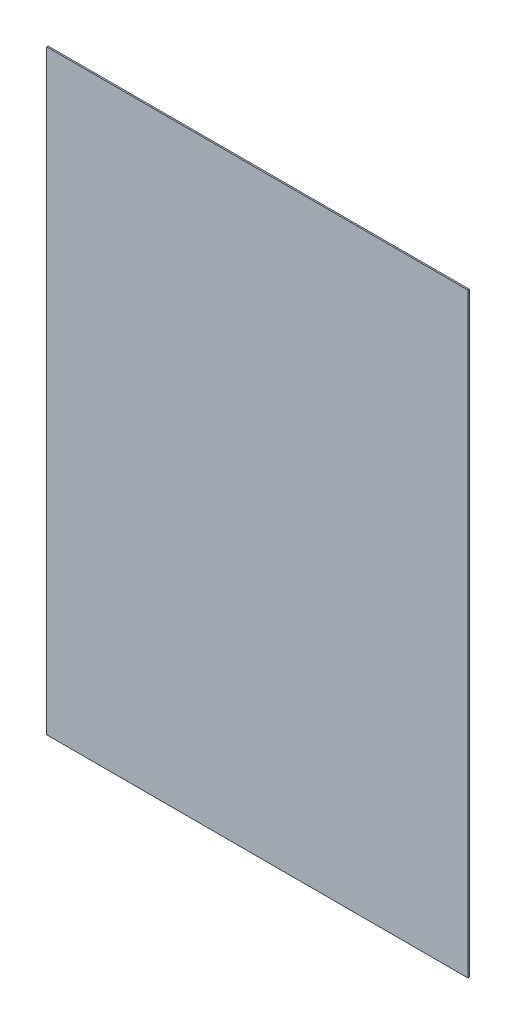
ISO-10303-21;
HEADER;
FILE_DESCRIPTION(('STEP AP214'),'2;1');
FILE_NAME('part.step','',(''),(''),'','','');
FILE_SCHEMA(('AUTOMOTIVE_DESIGN { 1 0 10303 214 1 1 1 1 }'));
ENDSEC;
DATA;
#1=APPLICATION_CONTEXT('core data for automotive mechanical design processes');
#2=APPLICATION_PROTOCOL_DEFINITION('international standard','automotive_design',2000,#1);
#3=PRODUCT_CONTEXT('',#1,'mechanical');
#4=PRODUCT('Part','Part','',(#3));
#5=PRODUCT_RELATED_PRODUCT_CATEGORY('part','',(#4));
#6=PRODUCT_DEFINITION_FORMATION('','',#4);
#7=PRODUCT_DEFINITION_CONTEXT('part definition',#1,'design');
#8=PRODUCT_DEFINITION('design','',#6,#7);
#9=PRODUCT_DEFINITION_SHAPE('','',#8);
#10=(LENGTH_UNIT() NAMED_UNIT(*) SI_UNIT(.MILLI.,.METRE.));
#11=(NAMED_UNIT(*) PLANE_ANGLE_UNIT() SI_UNIT($,.RADIAN.));
#12=(NAMED_UNIT(*) SI_UNIT($,.STERADIAN.) SOLID_ANGLE_UNIT());
#13=UNCERTAINTY_MEASURE_WITH_UNIT(LENGTH_MEASURE(1.E-05),#10,'distance_accuracy_value','');
#14=(GEOMETRIC_REPRESENTATION_CONTEXT(3) GLOBAL_UNCERTAINTY_ASSIGNED_CONTEXT((#13)) GLOBAL_UNIT_ASSIGNED_CONTEXT((#10,
#11,#12)) REPRESENTATION_CONTEXT('',''));
#15=CARTESIAN_POINT('',(0.,0.,0.));
#16=DIRECTION('',(0.,0.,1.));
#17=DIRECTION('',(1.,0.,0.));
#18=AXIS2_PLACEMENT_3D('',#15,#16,#17);
#19=CARTESIAN_POINT('',(0.,0.,0.5));
#20=DIRECTION('',(1.,0.,0.));
#21=DIRECTION('',(0.,0.,-1.));
#22=AXIS2_PLACEMENT_3D('',#19,#20,#21);
#23=PLANE('',#22);
#24=DIRECTION('',(0.,-1.,0.));
#25=VECTOR('',#24,1.);
#26=CARTESIAN_POINT('',(0.,0.,0.));
#27=LINE('',#26,#25);
#28=CARTESIAN_POINT('',(0.,210.,0.));
#29=VERTEX_POINT('',#28);
#30=CARTESIAN_POINT('',(0.,0.,0.));
#31=VERTEX_POINT('',#30);
#32=EDGE_CURVE('E95',#29,#31,#27,.T.);
#33=ORIENTED_EDGE('',*,*,#32,.T.);
#34=DIRECTION('',(0.,0.,-1.));
#35=VECTOR('',#34,1.);
#36=CARTESIAN_POINT('',(0.,0.,0.5));
#37=LINE('',#36,#35);
#38=CARTESIAN_POINT('',(0.,0.,0.5));
#39=VERTEX_POINT('',#38);
#40=EDGE_CURVE('E11',#39,#31,#37,.T.);
#41=ORIENTED_EDGE('',*,*,#40,.F.);
#42=DIRECTION('',(0.,-1.,0.));
#43=VECTOR('',#42,1.);
#44=CARTESIAN_POINT('',(0.,0.,0.5));
#45=LINE('',#44,#43);
#46=CARTESIAN_POINT('',(0.,210.,0.5));
#47=VERTEX_POINT('',#46);
#48=EDGE_CURVE('E83',#47,#39,#45,.T.);
#49=ORIENTED_EDGE('',*,*,#48,.F.);
#50=DIRECTION('',(0.,0.,-1.));
#51=VECTOR('',#50,1.);
#52=CARTESIAN_POINT('',(0.,210.,0.5));
#53=LINE('',#52,#51);
#54=EDGE_CURVE('E91',#47,#29,#53,.T.);
#55=ORIENTED_EDGE('',*,*,#54,.T.);
#56=EDGE_LOOP('',(#33,#41,#49,#55));
#57=FACE_BOUND('',#56,.T.);
#58=ADVANCED_FACE('F32',(#57),#23,.F.);
#59=CARTESIAN_POINT('',(0.,0.,0.5));
#60=DIRECTION('',(0.,1.,0.));
#61=DIRECTION('',(0.,0.,1.));
#62=AXIS2_PLACEMENT_3D('',#59,#60,#61);
#63=PLANE('',#62);
#64=DIRECTION('',(1.,0.,0.));
#65=VECTOR('',#64,1.);
#66=CARTESIAN_POINT('',(0.,0.,0.));
#67=LINE('',#66,#65);
#68=CARTESIAN_POINT('',(148.5,0.,0.));
#69=VERTEX_POINT('',#68);
#70=EDGE_CURVE('E87',#31,#69,#67,.T.);
#71=ORIENTED_EDGE('',*,*,#70,.T.);
#72=DIRECTION('',(0.,0.,-1.));
#73=VECTOR('',#72,1.);
#74=CARTESIAN_POINT('',(148.5,0.,0.5));
#75=LINE('',#74,#73);
#76=CARTESIAN_POINT('',(148.5,0.,0.5));
#77=VERTEX_POINT('',#76);
#78=EDGE_CURVE('E40',#77,#69,#75,.T.);
#79=ORIENTED_EDGE('',*,*,#78,.F.);
#80=DIRECTION('',(1.,0.,0.));
#81=VECTOR('',#80,1.);
#82=CARTESIAN_POINT('',(0.,0.,0.5));
#83=LINE('',#82,#81);
#84=EDGE_CURVE('E78',#39,#77,#83,.T.);
#85=ORIENTED_EDGE('',*,*,#84,.F.);
#86=ORIENTED_EDGE('',*,*,#40,.T.);
#87=EDGE_LOOP('',(#71,#79,#85,#86));
#88=FACE_BOUND('',#87,.T.);
#89=ADVANCED_FACE('F86',(#88),#63,.F.);
#90=CARTESIAN_POINT('',(148.5,0.,0.5));
#91=DIRECTION('',(-1.,0.,0.));
#92=DIRECTION('',(0.,0.,1.));
#93=AXIS2_PLACEMENT_3D('',#90,#91,#92);
#94=PLANE('',#93);
#95=DIRECTION('',(0.,1.,0.));
#96=VECTOR('',#95,1.);
#97=CARTESIAN_POINT('',(148.5,0.,0.));
#98=LINE('',#97,#96);
#99=CARTESIAN_POINT('',(148.5,210.,0.));
#100=VERTEX_POINT('',#99);
#101=EDGE_CURVE('E65',#69,#100,#98,.T.);
#102=ORIENTED_EDGE('',*,*,#101,.T.);
#103=DIRECTION('',(0.,0.,-1.));
#104=VECTOR('',#103,1.);
#105=CARTESIAN_POINT('',(148.5,210.,0.5));
#106=LINE('',#105,#104);
#107=CARTESIAN_POINT('',(148.5,210.,0.5));
#108=VERTEX_POINT('',#107);
#109=EDGE_CURVE('E88',#108,#100,#106,.T.);
#110=ORIENTED_EDGE('',*,*,#109,.F.);
#111=DIRECTION('',(0.,1.,0.));
#112=VECTOR('',#111,1.);
#113=CARTESIAN_POINT('',(148.5,0.,0.5));
#114=LINE('',#113,#112);
#115=EDGE_CURVE('E81',#77,#108,#114,.T.);
#116=ORIENTED_EDGE('',*,*,#115,.F.);
#117=ORIENTED_EDGE('',*,*,#78,.T.);
#118=EDGE_LOOP('',(#102,#110,#116,#117));
#119=FACE_BOUND('',#118,.T.);
#120=ADVANCED_FACE('F89',(#119),#94,.F.);
#121=CARTESIAN_POINT('',(0.,210.,0.5));
#122=DIRECTION('',(0.,-1.,0.));
#123=DIRECTION('',(0.,0.,-1.));
#124=AXIS2_PLACEMENT_3D('',#121,#122,#123);
#125=PLANE('',#124);
#126=DIRECTION('',(-1.,0.,0.));
#127=VECTOR('',#126,1.);
#128=CARTESIAN_POINT('',(0.,210.,0.));
#129=LINE('',#128,#127);
#130=EDGE_CURVE('E71',#100,#29,#129,.T.);
#131=ORIENTED_EDGE('',*,*,#130,.T.);
#132=ORIENTED_EDGE('',*,*,#54,.F.);
#133=DIRECTION('',(-1.,0.,0.));
#134=VECTOR('',#133,1.);
#135=CARTESIAN_POINT('',(0.,210.,0.5));
#136=LINE('',#135,#134);
#137=EDGE_CURVE('E48',#108,#47,#136,.T.);
#138=ORIENTED_EDGE('',*,*,#137,.F.);
#139=ORIENTED_EDGE('',*,*,#109,.T.);
#140=EDGE_LOOP('',(#131,#132,#138,#139));
#141=FACE_BOUND('',#140,.T.);
#142=ADVANCED_FACE('F102',(#141),#125,.F.);
#143=CARTESIAN_POINT('',(0.,0.,0.5));
#144=DIRECTION('',(0.,0.,-1.));
#145=DIRECTION('',(-1.,0.,0.));
#146=AXIS2_PLACEMENT_3D('',#143,#144,#145);
#147=PLANE('',#146);
#148=ORIENTED_EDGE('',*,*,#48,.T.);
#149=ORIENTED_EDGE('',*,*,#84,.T.);
#150=ORIENTED_EDGE('',*,*,#115,.T.);
#151=ORIENTED_EDGE('',*,*,#137,.T.);
#152=EDGE_LOOP('',(#148,#149,#150,#151));
#153=FACE_BOUND('',#152,.T.);
#154=ADVANCED_FACE('F79',(#153),#147,.F.);
#155=CARTESIAN_POINT('',(0.,0.,0.));
#156=DIRECTION('',(0.,0.,-1.));
#157=DIRECTION('',(-1.,0.,0.));
#158=AXIS2_PLACEMENT_3D('',#155,#156,#157);
#159=PLANE('',#158);
#160=ORIENTED_EDGE('',*,*,#32,.F.);
#161=ORIENTED_EDGE('',*,*,#130,.F.);
#162=ORIENTED_EDGE('',*,*,#101,.F.);
#163=ORIENTED_EDGE('',*,*,#70,.F.);
#164=EDGE_LOOP('',(#160,#161,#162,#163));
#165=FACE_BOUND('',#164,.T.);
#166=ADVANCED_FACE('F105',(#165),#159,.T.);
#167=CLOSED_SHELL('',(#58,#89,#120,#142,#154,#166));
#168=MANIFOLD_SOLID_BREP('B2',#167);
#169=ADVANCED_BREP_SHAPE_REPRESENTATION('',(#18,#168),#14);
#170=SHAPE_DEFINITION_REPRESENTATION(#9,#169);
ENDSEC;
END-ISO-10303-21;
